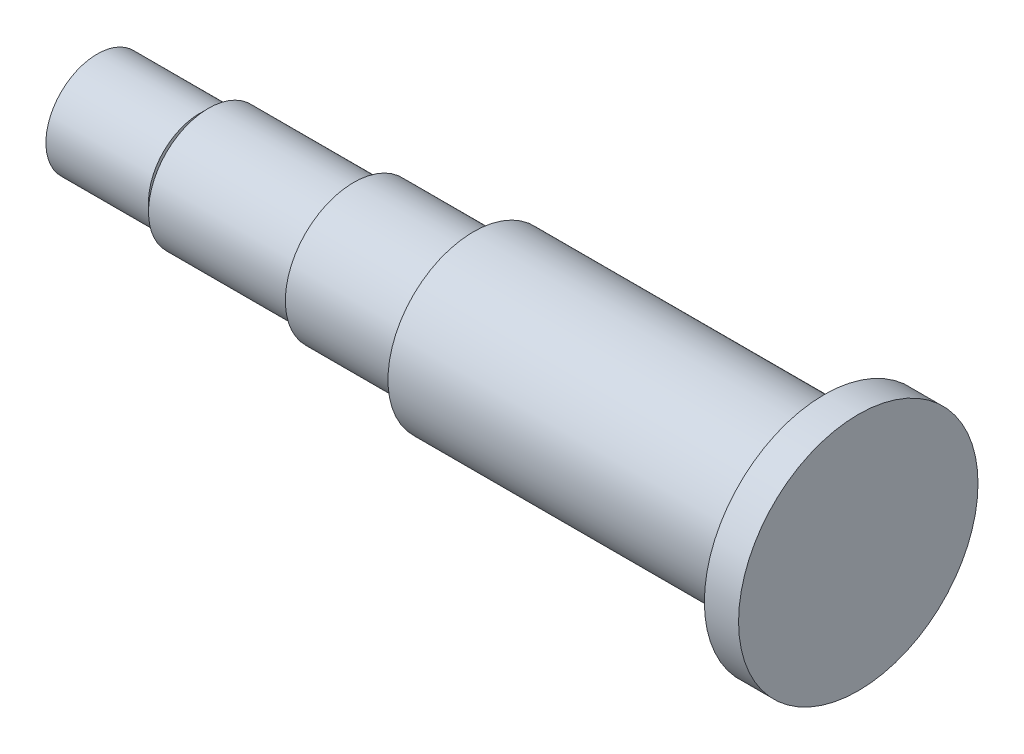
ISO-10303-21;
HEADER;
FILE_DESCRIPTION(('STEP AP214'),'2;1');
FILE_NAME('part.step','',(''),(''),'','','');
FILE_SCHEMA(('AUTOMOTIVE_DESIGN { 1 0 10303 214 1 1 1 1 }'));
ENDSEC;
DATA;
#1=APPLICATION_CONTEXT('core data for automotive mechanical design processes');
#2=APPLICATION_PROTOCOL_DEFINITION('international standard','automotive_design',2000,#1);
#3=PRODUCT_CONTEXT('',#1,'mechanical');
#4=PRODUCT('Part','Part','',(#3));
#5=PRODUCT_RELATED_PRODUCT_CATEGORY('part','',(#4));
#6=PRODUCT_DEFINITION_FORMATION('','',#4);
#7=PRODUCT_DEFINITION_CONTEXT('part definition',#1,'design');
#8=PRODUCT_DEFINITION('design','',#6,#7);
#9=PRODUCT_DEFINITION_SHAPE('','',#8);
#10=(LENGTH_UNIT() NAMED_UNIT(*) SI_UNIT(.MILLI.,.METRE.));
#11=(NAMED_UNIT(*) PLANE_ANGLE_UNIT() SI_UNIT($,.RADIAN.));
#12=(NAMED_UNIT(*) SI_UNIT($,.STERADIAN.) SOLID_ANGLE_UNIT());
#13=UNCERTAINTY_MEASURE_WITH_UNIT(LENGTH_MEASURE(1.E-05),#10,'distance_accuracy_value','');
#14=(GEOMETRIC_REPRESENTATION_CONTEXT(3) GLOBAL_UNCERTAINTY_ASSIGNED_CONTEXT((#13)) GLOBAL_UNIT_ASSIGNED_CONTEXT((#10,
#11,#12)) REPRESENTATION_CONTEXT('',''));
#15=CARTESIAN_POINT('',(0.,0.,0.));
#16=DIRECTION('',(0.,0.,1.));
#17=DIRECTION('',(1.,0.,0.));
#18=AXIS2_PLACEMENT_3D('',#15,#16,#17);
#19=CARTESIAN_POINT('',(25.5,0.,-6.53834841531101));
#20=DIRECTION('',(0.,0.,-1.));
#21=DIRECTION('',(0.,1.,0.));
#22=AXIS2_PLACEMENT_3D('',#19,#20,#21);
#23=CYLINDRICAL_SURFACE('',#22,2.5);
#24=DIRECTION('',(0.,0.,1.));
#25=VECTOR('',#24,1.);
#26=CARTESIAN_POINT('',(25.5,2.5,-6.53834841531101));
#27=LINE('',#26,#25);
#28=CARTESIAN_POINT('',(25.5,2.5,-6.53834841531101));
#29=VERTEX_POINT('',#28);
#30=CARTESIAN_POINT('',(25.5,2.5,-3.));
#31=VERTEX_POINT('',#30);
#32=EDGE_CURVE('E113',#29,#31,#27,.T.);
#33=ORIENTED_EDGE('',*,*,#32,.F.);
#34=CARTESIAN_POINT('',(25.5,-2.5,-6.53834841531101));
#35=CARTESIAN_POINT('',(25.5678893420284,-2.50000932266218,-6.5383365377931));
#36=CARTESIAN_POINT('',(25.6357721253043,-2.49723484311805,-6.53940550223188));
#37=CARTESIAN_POINT('',(25.7710042937708,-2.48619098182841,-6.54361658968053));
#38=CARTESIAN_POINT('',(25.8383538358949,-2.47792328256424,-6.54675807790892));
#39=CARTESIAN_POINT('',(25.9718218867899,-2.45600165990461,-6.5550122113627));
#40=CARTESIAN_POINT('',(26.0379437121548,-2.44236551556639,-6.56011834886744));
#41=CARTESIAN_POINT('',(26.1687020205636,-2.40985109916335,-6.57213179830297));
#42=CARTESIAN_POINT('',(26.2333384378105,-2.39097259536804,-6.57903918985462));
#43=CARTESIAN_POINT('',(26.4242660750523,-2.32673907681003,-6.60214955092255));
#44=CARTESIAN_POINT('',(26.5477937694133,-2.27374975655494,-6.62075525558913));
#45=CARTESIAN_POINT('',(26.7842333853739,-2.14910558938752,-6.66225458983626));
#46=CARTESIAN_POINT('',(26.8971377827942,-2.07743764637951,-6.68515122472878));
#47=CARTESIAN_POINT('',(27.1142059599975,-1.91403288540698,-6.73379707260592));
#48=CARTESIAN_POINT('',(27.2178290856801,-1.82159966200599,-6.75962434048961));
#49=CARTESIAN_POINT('',(27.4084942540686,-1.6207511396363,-6.81057171506884));
#50=CARTESIAN_POINT('',(27.4955304373075,-1.51233021679002,-6.83569156920423));
#51=CARTESIAN_POINT('',(27.6531254526953,-1.27848908744294,-6.88332224060736));
#52=CARTESIAN_POINT('',(27.7230930795831,-1.15264761858671,-6.90572865345081));
#53=CARTESIAN_POINT('',(27.8405810888394,-0.890114775140083,-6.94443820524935));
#54=CARTESIAN_POINT('',(27.8881292240817,-0.753437060892537,-6.96074888483691));
#55=CARTESIAN_POINT('',(27.9488703239068,-0.513499185932259,-6.98186406835635));
#56=CARTESIAN_POINT('',(27.9680019679596,-0.411876025518192,-6.98862590392809));
#57=CARTESIAN_POINT('',(27.9935684687235,-0.206847500957756,-6.99769531355425));
#58=CARTESIAN_POINT('',(28.0000042487225,-0.103442266961775,-7.00000321151438));
#59=CARTESIAN_POINT('',(27.9999944249849,0.135733083304377,-6.99999578597066));
#60=CARTESIAN_POINT('',(27.9889005957564,0.271529928892494,-6.99601237084189));
#61=CARTESIAN_POINT('',(27.9449390941754,0.539164810430855,-6.98049556621262));
#62=CARTESIAN_POINT('',(27.9120536412801,0.6709995216371,-6.96895601148651));
#63=CARTESIAN_POINT('',(27.8258114022584,0.926697229908988,-6.93957968174648));
#64=CARTESIAN_POINT('',(27.7724992396917,1.05057692127769,-6.92175664017616));
#65=CARTESIAN_POINT('',(27.6471018081266,1.28761181804177,-6.88160792882471));
#66=CARTESIAN_POINT('',(27.5750145271901,1.40076587230642,-6.85928177654897));
#67=CARTESIAN_POINT('',(27.4111596788848,1.61758423552249,-6.81147453258769));
#68=CARTESIAN_POINT('',(27.3187879293096,1.72077339997961,-6.78590996821348));
#69=CARTESIAN_POINT('',(27.1182596501664,1.91057675407357,-6.73493675432232));
#70=CARTESIAN_POINT('',(27.0100979411477,1.99718548333671,-6.70952815882737));
#71=CARTESIAN_POINT('',(26.7765604628921,2.15426693338204,-6.66079164959046));
#72=CARTESIAN_POINT('',(26.6507221443154,2.22408573995861,-6.6375647459348));
#73=CARTESIAN_POINT('',(26.3881798938303,2.34131441413782,-6.59712910699575));
#74=CARTESIAN_POINT('',(26.2514882279059,2.38874916968613,-6.57991369333931));
#75=CARTESIAN_POINT('',(26.0118654616456,2.44919226451307,-6.55760597786704));
#76=CARTESIAN_POINT('',(25.9106007541053,2.46818905642206,-6.55044763024966));
#77=CARTESIAN_POINT('',(25.7062500727319,2.49361455697107,-6.5407900801244));
#78=CARTESIAN_POINT('',(25.6031633648473,2.5000380779737,-6.53829280075808));
#79=CARTESIAN_POINT('',(25.5,2.5,-6.53834841531101));
#80=B_SPLINE_CURVE_WITH_KNOTS('',3,(#34,#35,#36,#37,#38,#39,#40,#41,#42,#43,#44,#45,#46,#47,#48,
#49,#50,#51,#52,#53,#54,#55,#56,#57,#58,#59,#60,#61,#62,#63,#64,#65,#66,#67,#68,#69,#70,#71,#72,
#73,#74,#75,#76,#77,#78,#79),.UNSPECIFIED.,.F.,.F.,(4,2,2,2,2,2,2,2,2,2,2,2,2,2,2,2,2,2,2,2,2,2,
4),(0.,0.203591917318646,0.407121506564667,0.609982647293873,0.81285275661766,1.21793662716396,
1.62330528078397,2.04512461070487,2.46709267649777,2.90207932018936,3.33652607516409,
3.6465782340069,3.95660784393645,4.36341713096607,4.770558757209,5.17681597932535,
5.58311675381183,6.00374032812683,6.42450218745642,6.85966862832313,7.29435007803267,
7.60334548413229,7.91246835257098),.UNSPECIFIED.);
#81=CARTESIAN_POINT('',(25.5,-2.5,-6.53834841531101));
#82=VERTEX_POINT('',#81);
#83=EDGE_CURVE('E11',#29,#82,#80,.F.);
#84=ORIENTED_EDGE('',*,*,#83,.T.);
#85=DIRECTION('',(0.,0.,1.));
#86=VECTOR('',#85,1.);
#87=CARTESIAN_POINT('',(25.5,-2.5,-6.53834841531101));
#88=LINE('',#87,#86);
#89=CARTESIAN_POINT('',(25.5,-2.5,-3.));
#90=VERTEX_POINT('',#89);
#91=EDGE_CURVE('E228',#90,#82,#88,.F.);
#92=ORIENTED_EDGE('',*,*,#91,.F.);
#93=CARTESIAN_POINT('',(25.5,0.,-3.));
#94=DIRECTION('',(0.,0.,-1.));
#95=DIRECTION('',(0.,1.,0.));
#96=AXIS2_PLACEMENT_3D('',#93,#94,#95);
#97=CIRCLE('',#96,2.5);
#98=EDGE_CURVE('E60',#31,#90,#97,.T.);
#99=ORIENTED_EDGE('',*,*,#98,.F.);
#100=EDGE_LOOP('',(#33,#84,#92,#99));
#101=FACE_BOUND('',#100,.T.);
#102=ADVANCED_FACE('F45',(#101),#23,.F.);
#103=CARTESIAN_POINT('',(18.5,0.,-3.));
#104=DIRECTION('',(0.,0.,-1.));
#105=DIRECTION('',(0.,1.,0.));
#106=AXIS2_PLACEMENT_3D('',#103,#104,#105);
#107=CYLINDRICAL_SURFACE('',#106,2.5);
#108=DIRECTION('',(0.,0.,-1.));
#109=VECTOR('',#108,1.);
#110=CARTESIAN_POINT('',(18.5,2.5,-7.54987069207701));
#111=LINE('',#110,#109);
#112=CARTESIAN_POINT('',(18.5,2.5,-3.));
#113=VERTEX_POINT('',#112);
#114=CARTESIAN_POINT('',(18.5,2.5,-6.53834841531101));
#115=VERTEX_POINT('',#114);
#116=EDGE_CURVE('E104',#113,#115,#111,.T.);
#117=ORIENTED_EDGE('',*,*,#116,.F.);
#118=CARTESIAN_POINT('',(18.5,0.,-3.));
#119=DIRECTION('',(0.,0.,-1.));
#120=DIRECTION('',(0.,1.,0.));
#121=AXIS2_PLACEMENT_3D('',#118,#119,#120);
#122=CIRCLE('',#121,2.5);
#123=CARTESIAN_POINT('',(18.5,-2.5,-3.));
#124=VERTEX_POINT('',#123);
#125=EDGE_CURVE('E88',#124,#113,#122,.T.);
#126=ORIENTED_EDGE('',*,*,#125,.F.);
#127=DIRECTION('',(0.,0.,-1.));
#128=VECTOR('',#127,1.);
#129=CARTESIAN_POINT('',(18.5,-2.5,-7.54987069207701));
#130=LINE('',#129,#128);
#131=CARTESIAN_POINT('',(18.5,-2.5,-6.53834841531101));
#132=VERTEX_POINT('',#131);
#133=EDGE_CURVE('E100',#132,#124,#130,.F.);
#134=ORIENTED_EDGE('',*,*,#133,.F.);
#135=CARTESIAN_POINT('',(18.5,2.5,-6.53834841531101));
#136=CARTESIAN_POINT('',(18.4321106579716,2.50000932266218,-6.5383365377931));
#137=CARTESIAN_POINT('',(18.3642278746957,2.49723484311805,-6.53940550223188));
#138=CARTESIAN_POINT('',(18.2289957062292,2.48619098182841,-6.54361658968053));
#139=CARTESIAN_POINT('',(18.1616461641051,2.47792328256424,-6.54675807790892));
#140=CARTESIAN_POINT('',(18.0281781132102,2.45600165990461,-6.5550122113627));
#141=CARTESIAN_POINT('',(17.9620562878452,2.44236551556639,-6.56011834886744));
#142=CARTESIAN_POINT('',(17.8312979794364,2.40985109916335,-6.57213179830297));
#143=CARTESIAN_POINT('',(17.7666615621895,2.39097259536804,-6.57903918985462));
#144=CARTESIAN_POINT('',(17.5757339249477,2.32673907681002,-6.60214955092255));
#145=CARTESIAN_POINT('',(17.4522062305868,2.27374975655494,-6.62075525558913));
#146=CARTESIAN_POINT('',(17.2157666146261,2.14910558938752,-6.66225458983626));
#147=CARTESIAN_POINT('',(17.1028622172058,2.07743764637951,-6.68515122472878));
#148=CARTESIAN_POINT('',(16.8857940400025,1.91403288540698,-6.73379707260592));
#149=CARTESIAN_POINT('',(16.7821709143199,1.82159966200598,-6.75962434048962));
#150=CARTESIAN_POINT('',(16.5915057459315,1.6207511396363,-6.81057171506884));
#151=CARTESIAN_POINT('',(16.5044695626925,1.51233021679001,-6.83569156920423));
#152=CARTESIAN_POINT('',(16.3468745473047,1.27848908744293,-6.88332224060736));
#153=CARTESIAN_POINT('',(16.2769069204169,1.1526476185867,-6.90572865345081));
#154=CARTESIAN_POINT('',(16.1594189111606,0.89011477514008,-6.94443820524935));
#155=CARTESIAN_POINT('',(16.1118707759183,0.753437060892534,-6.96074888483691));
#156=CARTESIAN_POINT('',(16.0511296760932,0.513499185932231,-6.98186406835635));
#157=CARTESIAN_POINT('',(16.0319980320404,0.411876025518138,-6.98862590392809));
#158=CARTESIAN_POINT('',(16.0064315312765,0.206847500957649,-6.99769531355425));
#159=CARTESIAN_POINT('',(15.9999957512775,0.103442266961641,-7.00000321151438));
#160=CARTESIAN_POINT('',(16.0000055750151,-0.135733083304538,-6.99999578597065));
#161=CARTESIAN_POINT('',(16.0110994042436,-0.271529928892656,-6.99601237084188));
#162=CARTESIAN_POINT('',(16.0550609058247,-0.539164810431016,-6.98049556621261));
#163=CARTESIAN_POINT('',(16.0879463587199,-0.67099952163726,-6.96895601148649));
#164=CARTESIAN_POINT('',(16.1741885977417,-0.926697229909143,-6.93957968174646));
#165=CARTESIAN_POINT('',(16.2275007603084,-1.05057692127784,-6.92175664017614));
#166=CARTESIAN_POINT('',(16.3528981918735,-1.28761181804191,-6.88160792882468));
#167=CARTESIAN_POINT('',(16.42498547281,-1.40076587230656,-6.85928177654894));
#168=CARTESIAN_POINT('',(16.5888403211154,-1.61758423552262,-6.81147453258766));
#169=CARTESIAN_POINT('',(16.6812120706906,-1.72077339997973,-6.78590996821344));
#170=CARTESIAN_POINT('',(16.8817403498338,-1.91057675407369,-6.73493675432228));
#171=CARTESIAN_POINT('',(16.9899020588525,-1.99718548333682,-6.70952815882733));
#172=CARTESIAN_POINT('',(17.2234395371081,-2.15426693338213,-6.66079164959043));
#173=CARTESIAN_POINT('',(17.3492778556848,-2.2240857399587,-6.63756474593478));
#174=CARTESIAN_POINT('',(17.6118201061699,-2.34131441413788,-6.59712910699572));
#175=CARTESIAN_POINT('',(17.7485117720943,-2.38874916968619,-6.57991369333929));
#176=CARTESIAN_POINT('',(17.9881345383546,-2.4491922645131,-6.55760597786702));
#177=CARTESIAN_POINT('',(18.0893992458948,-2.46818905642208,-6.55044763024965));
#178=CARTESIAN_POINT('',(18.2937499272682,-2.49361455697107,-6.5407900801244));
#179=CARTESIAN_POINT('',(18.3968366351527,-2.5000380779737,-6.53829280075808));
#180=CARTESIAN_POINT('',(18.5,-2.5,-6.53834841531101));
#181=B_SPLINE_CURVE_WITH_KNOTS('',3,(#135,#136,#137,#138,#139,#140,#141,#142,#143,#144,#145,
#146,#147,#148,#149,#150,#151,#152,#153,#154,#155,#156,#157,#158,#159,#160,#161,#162,#163,#164,
#165,#166,#167,#168,#169,#170,#171,#172,#173,#174,#175,#176,#177,#178,#179,#180),.UNSPECIFIED.,
.F.,.F.,(4,2,2,2,2,2,2,2,2,2,2,2,2,2,2,2,2,2,2,2,2,2,4),(0.,0.203591917318646,0.407121506564666,
0.609982647293873,0.81285275661766,1.21793662716396,1.62330528078397,2.04512461070487,
2.46709267649777,2.90207932018936,3.33652607516409,3.64657823400698,3.9566078439366,
4.36341713096623,4.77055875720917,5.17681597932552,5.583116753812,6.00374032812701,
6.42450218745659,6.85966862832332,7.29435007803284,7.60334548413238,7.91246835257097),.UNSPECIFIED.);
#182=EDGE_CURVE('E99',#132,#115,#181,.F.);
#183=ORIENTED_EDGE('',*,*,#182,.T.);
#184=EDGE_LOOP('',(#117,#126,#134,#183));
#185=FACE_BOUND('',#184,.T.);
#186=ADVANCED_FACE('F105',(#185),#107,.F.);
#187=CARTESIAN_POINT('',(0.,0.,0.));
#188=DIRECTION('',(-1.,0.,0.));
#189=DIRECTION('',(0.,0.,1.));
#190=AXIS2_PLACEMENT_3D('',#187,#188,#189);
#191=PLANE('',#190);
#192=CARTESIAN_POINT('',(0.,0.,0.));
#193=DIRECTION('',(1.,0.,0.));
#194=DIRECTION('',(0.,0.,-1.));
#195=AXIS2_PLACEMENT_3D('',#192,#193,#194);
#196=CIRCLE('',#195,6.);
#197=CARTESIAN_POINT('',(0.,0.,-6.));
#198=VERTEX_POINT('',#197);
#199=EDGE_CURVE('E171',#198,#198,#196,.T.);
#200=ORIENTED_EDGE('',*,*,#199,.F.);
#201=EDGE_LOOP('',(#200));
#202=FACE_BOUND('',#201,.T.);
#203=ADVANCED_FACE('F216',(#202),#191,.T.);
#204=CARTESIAN_POINT('',(0.,0.,0.));
#205=DIRECTION('',(1.,0.,0.));
#206=DIRECTION('',(0.,0.,-1.));
#207=AXIS2_PLACEMENT_3D('',#204,#205,#206);
#208=CYLINDRICAL_SURFACE('',#207,6.);
#209=ORIENTED_EDGE('',*,*,#199,.T.);
#210=EDGE_LOOP('',(#209));
#211=FACE_BOUND('',#210,.T.);
#212=CARTESIAN_POINT('',(12.,0.,0.));
#213=DIRECTION('',(1.,0.,0.));
#214=DIRECTION('',(0.,0.,-1.));
#215=AXIS2_PLACEMENT_3D('',#212,#213,#214);
#216=CIRCLE('',#215,6.);
#217=CARTESIAN_POINT('',(12.,0.,-6.));
#218=VERTEX_POINT('',#217);
#219=EDGE_CURVE('E167',#218,#218,#216,.T.);
#220=ORIENTED_EDGE('',*,*,#219,.F.);
#221=EDGE_LOOP('',(#220));
#222=FACE_BOUND('',#221,.T.);
#223=ADVANCED_FACE('F213',(#211,#222),#208,.T.);
#224=CARTESIAN_POINT('',(12.,6.,0.));
#225=DIRECTION('',(1.,0.,0.));
#226=DIRECTION('',(0.,0.,-1.));
#227=AXIS2_PLACEMENT_3D('',#224,#225,#226);
#228=PLANE('',#227);
#229=ORIENTED_EDGE('',*,*,#219,.T.);
#230=EDGE_LOOP('',(#229));
#231=FACE_BOUND('',#230,.T.);
#232=CARTESIAN_POINT('',(12.,0.,0.));
#233=DIRECTION('',(1.,0.,0.));
#234=DIRECTION('',(0.,0.,-1.));
#235=AXIS2_PLACEMENT_3D('',#232,#233,#234);
#236=CIRCLE('',#235,5.);
#237=CARTESIAN_POINT('',(12.,0.,-5.));
#238=VERTEX_POINT('',#237);
#239=EDGE_CURVE('E163',#238,#238,#236,.T.);
#240=ORIENTED_EDGE('',*,*,#239,.F.);
#241=EDGE_LOOP('',(#240));
#242=FACE_BOUND('',#241,.T.);
#243=ADVANCED_FACE('F209',(#231,#242),#228,.T.);
#244=CARTESIAN_POINT('',(0.,0.,0.));
#245=DIRECTION('',(1.,0.,0.));
#246=DIRECTION('',(0.,0.,-1.));
#247=AXIS2_PLACEMENT_3D('',#244,#245,#246);
#248=CYLINDRICAL_SURFACE('',#247,5.);
#249=ORIENTED_EDGE('',*,*,#239,.T.);
#250=EDGE_LOOP('',(#249));
#251=FACE_BOUND('',#250,.T.);
#252=CARTESIAN_POINT('',(13.,0.,0.));
#253=DIRECTION('',(1.,0.,0.));
#254=DIRECTION('',(0.,0.,-1.));
#255=AXIS2_PLACEMENT_3D('',#252,#253,#254);
#256=CIRCLE('',#255,5.);
#257=CARTESIAN_POINT('',(13.,0.,-5.));
#258=VERTEX_POINT('',#257);
#259=EDGE_CURVE('E159',#258,#258,#256,.T.);
#260=ORIENTED_EDGE('',*,*,#259,.F.);
#261=EDGE_LOOP('',(#260));
#262=FACE_BOUND('',#261,.T.);
#263=ADVANCED_FACE('F205',(#251,#262),#248,.T.);
#264=CARTESIAN_POINT('',(13.,5.,0.));
#265=DIRECTION('',(-1.,0.,0.));
#266=DIRECTION('',(0.,0.,1.));
#267=AXIS2_PLACEMENT_3D('',#264,#265,#266);
#268=PLANE('',#267);
#269=ORIENTED_EDGE('',*,*,#259,.T.);
#270=EDGE_LOOP('',(#269));
#271=FACE_BOUND('',#270,.T.);
#272=CARTESIAN_POINT('',(13.,0.,0.));
#273=DIRECTION('',(1.,0.,0.));
#274=DIRECTION('',(0.,0.,-1.));
#275=AXIS2_PLACEMENT_3D('',#272,#273,#274);
#276=CIRCLE('',#275,7.);
#277=CARTESIAN_POINT('',(13.,0.,-7.));
#278=VERTEX_POINT('',#277);
#279=EDGE_CURVE('E155',#278,#278,#276,.T.);
#280=ORIENTED_EDGE('',*,*,#279,.F.);
#281=EDGE_LOOP('',(#280));
#282=FACE_BOUND('',#281,.T.);
#283=ADVANCED_FACE('F199',(#271,#282),#268,.T.);
#284=CARTESIAN_POINT('',(0.,0.,0.));
#285=DIRECTION('',(1.,0.,0.));
#286=DIRECTION('',(0.,0.,-1.));
#287=AXIS2_PLACEMENT_3D('',#284,#285,#286);
#288=CYLINDRICAL_SURFACE('',#287,7.);
#289=ORIENTED_EDGE('',*,*,#83,.F.);
#290=DIRECTION('',(1.,0.,0.));
#291=VECTOR('',#290,1.);
#292=CARTESIAN_POINT('',(0.,2.5,-6.53834841531101));
#293=LINE('',#292,#291);
#294=EDGE_CURVE('E109',#29,#115,#293,.F.);
#295=ORIENTED_EDGE('',*,*,#294,.T.);
#296=ORIENTED_EDGE('',*,*,#182,.F.);
#297=DIRECTION('',(1.,0.,0.));
#298=VECTOR('',#297,1.);
#299=CARTESIAN_POINT('',(0.,-2.5,-6.53834841531101));
#300=LINE('',#299,#298);
#301=EDGE_CURVE('E175',#132,#82,#300,.T.);
#302=ORIENTED_EDGE('',*,*,#301,.T.);
#303=EDGE_LOOP('',(#289,#295,#296,#302));
#304=FACE_BOUND('',#303,.T.);
#305=ORIENTED_EDGE('',*,*,#279,.T.);
#306=EDGE_LOOP('',(#305));
#307=FACE_BOUND('',#306,.T.);
#308=CARTESIAN_POINT('',(30.,0.,0.));
#309=DIRECTION('',(1.,0.,0.));
#310=DIRECTION('',(0.,0.,-1.));
#311=AXIS2_PLACEMENT_3D('',#308,#309,#310);
#312=CIRCLE('',#311,7.);
#313=CARTESIAN_POINT('',(30.,0.,-7.));
#314=VERTEX_POINT('',#313);
#315=EDGE_CURVE('E151',#314,#314,#312,.T.);
#316=ORIENTED_EDGE('',*,*,#315,.F.);
#317=EDGE_LOOP('',(#316));
#318=FACE_BOUND('',#317,.T.);
#319=ADVANCED_FACE('F193',(#304,#307,#318),#288,.T.);
#320=CARTESIAN_POINT('',(30.,7.,0.));
#321=DIRECTION('',(-1.,0.,0.));
#322=DIRECTION('',(0.,0.,1.));
#323=AXIS2_PLACEMENT_3D('',#320,#321,#322);
#324=PLANE('',#323);
#325=ORIENTED_EDGE('',*,*,#315,.T.);
#326=EDGE_LOOP('',(#325));
#327=FACE_BOUND('',#326,.T.);
#328=CARTESIAN_POINT('',(30.,0.,0.));
#329=DIRECTION('',(1.,0.,0.));
#330=DIRECTION('',(0.,0.,-1.));
#331=AXIS2_PLACEMENT_3D('',#328,#329,#330);
#332=CIRCLE('',#331,8.);
#333=CARTESIAN_POINT('',(30.,0.,-8.));
#334=VERTEX_POINT('',#333);
#335=EDGE_CURVE('E147',#334,#334,#332,.T.);
#336=ORIENTED_EDGE('',*,*,#335,.F.);
#337=EDGE_LOOP('',(#336));
#338=FACE_BOUND('',#337,.T.);
#339=ADVANCED_FACE('F198',(#327,#338),#324,.T.);
#340=CARTESIAN_POINT('',(0.,0.,0.));
#341=DIRECTION('',(1.,0.,0.));
#342=DIRECTION('',(0.,0.,-1.));
#343=AXIS2_PLACEMENT_3D('',#340,#341,#342);
#344=CYLINDRICAL_SURFACE('',#343,8.);
#345=ORIENTED_EDGE('',*,*,#335,.T.);
#346=EDGE_LOOP('',(#345));
#347=FACE_BOUND('',#346,.T.);
#348=CARTESIAN_POINT('',(44.,0.,0.));
#349=DIRECTION('',(1.,0.,0.));
#350=DIRECTION('',(0.,0.,-1.));
#351=AXIS2_PLACEMENT_3D('',#348,#349,#350);
#352=CIRCLE('',#351,8.);
#353=CARTESIAN_POINT('',(44.,0.,-8.));
#354=VERTEX_POINT('',#353);
#355=EDGE_CURVE('E143',#354,#354,#352,.T.);
#356=ORIENTED_EDGE('',*,*,#355,.F.);
#357=EDGE_LOOP('',(#356));
#358=FACE_BOUND('',#357,.T.);
#359=ADVANCED_FACE('F270',(#347,#358),#344,.T.);
#360=CARTESIAN_POINT('',(44.,8.,0.));
#361=DIRECTION('',(-1.,0.,0.));
#362=DIRECTION('',(0.,0.,1.));
#363=AXIS2_PLACEMENT_3D('',#360,#361,#362);
#364=PLANE('',#363);
#365=ORIENTED_EDGE('',*,*,#355,.T.);
#366=EDGE_LOOP('',(#365));
#367=FACE_BOUND('',#366,.T.);
#368=CARTESIAN_POINT('',(44.,0.,0.));
#369=DIRECTION('',(1.,0.,0.));
#370=DIRECTION('',(0.,0.,-1.));
#371=AXIS2_PLACEMENT_3D('',#368,#369,#370);
#372=CIRCLE('',#371,10.);
#373=CARTESIAN_POINT('',(44.,0.,-10.));
#374=VERTEX_POINT('',#373);
#375=EDGE_CURVE('E139',#374,#374,#372,.T.);
#376=ORIENTED_EDGE('',*,*,#375,.F.);
#377=EDGE_LOOP('',(#376));
#378=FACE_BOUND('',#377,.T.);
#379=ADVANCED_FACE('F267',(#367,#378),#364,.T.);
#380=CARTESIAN_POINT('',(0.,0.,0.));
#381=DIRECTION('',(1.,0.,0.));
#382=DIRECTION('',(0.,0.,-1.));
#383=AXIS2_PLACEMENT_3D('',#380,#381,#382);
#384=CYLINDRICAL_SURFACE('',#383,10.);
#385=ORIENTED_EDGE('',*,*,#375,.T.);
#386=EDGE_LOOP('',(#385));
#387=FACE_BOUND('',#386,.T.);
#388=CARTESIAN_POINT('',(84.,0.,0.));
#389=DIRECTION('',(1.,0.,0.));
#390=DIRECTION('',(0.,0.,-1.));
#391=AXIS2_PLACEMENT_3D('',#388,#389,#390);
#392=CIRCLE('',#391,10.);
#393=CARTESIAN_POINT('',(84.,0.,-10.));
#394=VERTEX_POINT('',#393);
#395=EDGE_CURVE('E135',#394,#394,#392,.T.);
#396=ORIENTED_EDGE('',*,*,#395,.F.);
#397=EDGE_LOOP('',(#396));
#398=FACE_BOUND('',#397,.T.);
#399=ADVANCED_FACE('F263',(#387,#398),#384,.T.);
#400=CARTESIAN_POINT('',(84.,10.,0.));
#401=DIRECTION('',(1.,0.,0.));
#402=DIRECTION('',(0.,0.,-1.));
#403=AXIS2_PLACEMENT_3D('',#400,#401,#402);
#404=PLANE('',#403);
#405=ORIENTED_EDGE('',*,*,#395,.T.);
#406=EDGE_LOOP('',(#405));
#407=FACE_BOUND('',#406,.T.);
#408=CARTESIAN_POINT('',(84.,0.,0.));
#409=DIRECTION('',(1.,0.,0.));
#410=DIRECTION('',(0.,0.,-1.));
#411=AXIS2_PLACEMENT_3D('',#408,#409,#410);
#412=CIRCLE('',#411,9.00000000000001);
#413=CARTESIAN_POINT('',(84.,0.,-9.00000000000001));
#414=VERTEX_POINT('',#413);
#415=EDGE_CURVE('E131',#414,#414,#412,.T.);
#416=ORIENTED_EDGE('',*,*,#415,.F.);
#417=EDGE_LOOP('',(#416));
#418=FACE_BOUND('',#417,.T.);
#419=ADVANCED_FACE('F259',(#407,#418),#404,.T.);
#420=CARTESIAN_POINT('',(0.,0.,0.));
#421=DIRECTION('',(1.,0.,0.));
#422=DIRECTION('',(0.,0.,-1.));
#423=AXIS2_PLACEMENT_3D('',#420,#421,#422);
#424=CYLINDRICAL_SURFACE('',#423,9.00000000000001);
#425=ORIENTED_EDGE('',*,*,#415,.T.);
#426=EDGE_LOOP('',(#425));
#427=FACE_BOUND('',#426,.T.);
#428=CARTESIAN_POINT('',(85.,0.,0.));
#429=DIRECTION('',(1.,0.,0.));
#430=DIRECTION('',(0.,0.,-1.));
#431=AXIS2_PLACEMENT_3D('',#428,#429,#430);
#432=CIRCLE('',#431,9.00000000000001);
#433=CARTESIAN_POINT('',(85.,0.,-9.00000000000001));
#434=VERTEX_POINT('',#433);
#435=EDGE_CURVE('E127',#434,#434,#432,.T.);
#436=ORIENTED_EDGE('',*,*,#435,.F.);
#437=EDGE_LOOP('',(#436));
#438=FACE_BOUND('',#437,.T.);
#439=ADVANCED_FACE('F255',(#427,#438),#424,.T.);
#440=CARTESIAN_POINT('',(85.,9.00000000000001,0.));
#441=DIRECTION('',(-1.,0.,0.));
#442=DIRECTION('',(0.,0.,1.));
#443=AXIS2_PLACEMENT_3D('',#440,#441,#442);
#444=PLANE('',#443);
#445=ORIENTED_EDGE('',*,*,#435,.T.);
#446=EDGE_LOOP('',(#445));
#447=FACE_BOUND('',#446,.T.);
#448=CARTESIAN_POINT('',(85.,0.,0.));
#449=DIRECTION('',(1.,0.,0.));
#450=DIRECTION('',(0.,0.,-1.));
#451=AXIS2_PLACEMENT_3D('',#448,#449,#450);
#452=CIRCLE('',#451,14.);
#453=CARTESIAN_POINT('',(85.,0.,-14.));
#454=VERTEX_POINT('',#453);
#455=EDGE_CURVE('E120',#454,#454,#452,.T.);
#456=ORIENTED_EDGE('',*,*,#455,.F.);
#457=EDGE_LOOP('',(#456));
#458=FACE_BOUND('',#457,.T.);
#459=ADVANCED_FACE('F251',(#447,#458),#444,.T.);
#460=CARTESIAN_POINT('',(0.,0.,0.));
#461=DIRECTION('',(1.,0.,0.));
#462=DIRECTION('',(0.,0.,-1.));
#463=AXIS2_PLACEMENT_3D('',#460,#461,#462);
#464=CYLINDRICAL_SURFACE('',#463,14.);
#465=ORIENTED_EDGE('',*,*,#455,.T.);
#466=EDGE_LOOP('',(#465));
#467=FACE_BOUND('',#466,.T.);
#468=CARTESIAN_POINT('',(89.,0.,0.));
#469=DIRECTION('',(1.,0.,0.));
#470=DIRECTION('',(0.,0.,-1.));
#471=AXIS2_PLACEMENT_3D('',#468,#469,#470);
#472=CIRCLE('',#471,14.);
#473=CARTESIAN_POINT('',(89.,0.,-14.));
#474=VERTEX_POINT('',#473);
#475=EDGE_CURVE('E115',#474,#474,#472,.T.);
#476=ORIENTED_EDGE('',*,*,#475,.F.);
#477=EDGE_LOOP('',(#476));
#478=FACE_BOUND('',#477,.T.);
#479=ADVANCED_FACE('F247',(#467,#478),#464,.T.);
#480=CARTESIAN_POINT('',(89.,14.,0.));
#481=DIRECTION('',(1.,0.,0.));
#482=DIRECTION('',(0.,0.,-1.));
#483=AXIS2_PLACEMENT_3D('',#480,#481,#482);
#484=PLANE('',#483);
#485=ORIENTED_EDGE('',*,*,#475,.T.);
#486=EDGE_LOOP('',(#485));
#487=FACE_BOUND('',#486,.T.);
#488=ADVANCED_FACE('F244',(#487),#484,.T.);
#489=CARTESIAN_POINT('',(16.,2.5,-3.));
#490=DIRECTION('',(0.,0.,-1.));
#491=DIRECTION('',(0.,1.,0.));
#492=AXIS2_PLACEMENT_3D('',#489,#490,#491);
#493=PLANE('',#492);
#494=DIRECTION('',(1.,0.,0.));
#495=VECTOR('',#494,1.);
#496=CARTESIAN_POINT('',(16.,2.5,-3.));
#497=LINE('',#496,#495);
#498=EDGE_CURVE('E92',#113,#31,#497,.T.);
#499=ORIENTED_EDGE('',*,*,#498,.T.);
#500=ORIENTED_EDGE('',*,*,#98,.T.);
#501=DIRECTION('',(1.,0.,0.));
#502=VECTOR('',#501,1.);
#503=CARTESIAN_POINT('',(16.,-2.5,-3.));
#504=LINE('',#503,#502);
#505=EDGE_CURVE('E94',#124,#90,#504,.T.);
#506=ORIENTED_EDGE('',*,*,#505,.F.);
#507=ORIENTED_EDGE('',*,*,#125,.T.);
#508=EDGE_LOOP('',(#499,#500,#506,#507));
#509=FACE_BOUND('',#508,.T.);
#510=ADVANCED_FACE('F90',(#509),#493,.T.);
#511=CARTESIAN_POINT('',(16.,2.5,-7.54987069207701));
#512=DIRECTION('',(0.,-1.,0.));
#513=DIRECTION('',(0.,0.,-1.));
#514=AXIS2_PLACEMENT_3D('',#511,#512,#513);
#515=PLANE('',#514);
#516=ORIENTED_EDGE('',*,*,#294,.F.);
#517=ORIENTED_EDGE('',*,*,#32,.T.);
#518=ORIENTED_EDGE('',*,*,#498,.F.);
#519=ORIENTED_EDGE('',*,*,#116,.T.);
#520=EDGE_LOOP('',(#516,#517,#518,#519));
#521=FACE_BOUND('',#520,.T.);
#522=ADVANCED_FACE('F112',(#521),#515,.T.);
#523=CARTESIAN_POINT('',(16.,-2.5,-7.54987069207701));
#524=DIRECTION('',(0.,1.,0.));
#525=DIRECTION('',(0.,0.,1.));
#526=AXIS2_PLACEMENT_3D('',#523,#524,#525);
#527=PLANE('',#526);
#528=ORIENTED_EDGE('',*,*,#505,.T.);
#529=ORIENTED_EDGE('',*,*,#91,.T.);
#530=ORIENTED_EDGE('',*,*,#301,.F.);
#531=ORIENTED_EDGE('',*,*,#133,.T.);
#532=EDGE_LOOP('',(#528,#529,#530,#531));
#533=FACE_BOUND('',#532,.T.);
#534=ADVANCED_FACE('F232',(#533),#527,.T.);
#535=CLOSED_SHELL('',(#102,#186,#203,#223,#243,#263,#283,#319,#339,#359,#379,#399,#419,#439,
#459,#479,#488,#510,#522,#534));
#536=MANIFOLD_SOLID_BREP('B2',#535);
#537=ADVANCED_BREP_SHAPE_REPRESENTATION('',(#18,#536),#14);
#538=SHAPE_DEFINITION_REPRESENTATION(#9,#537);
ENDSEC;
END-ISO-10303-21;
